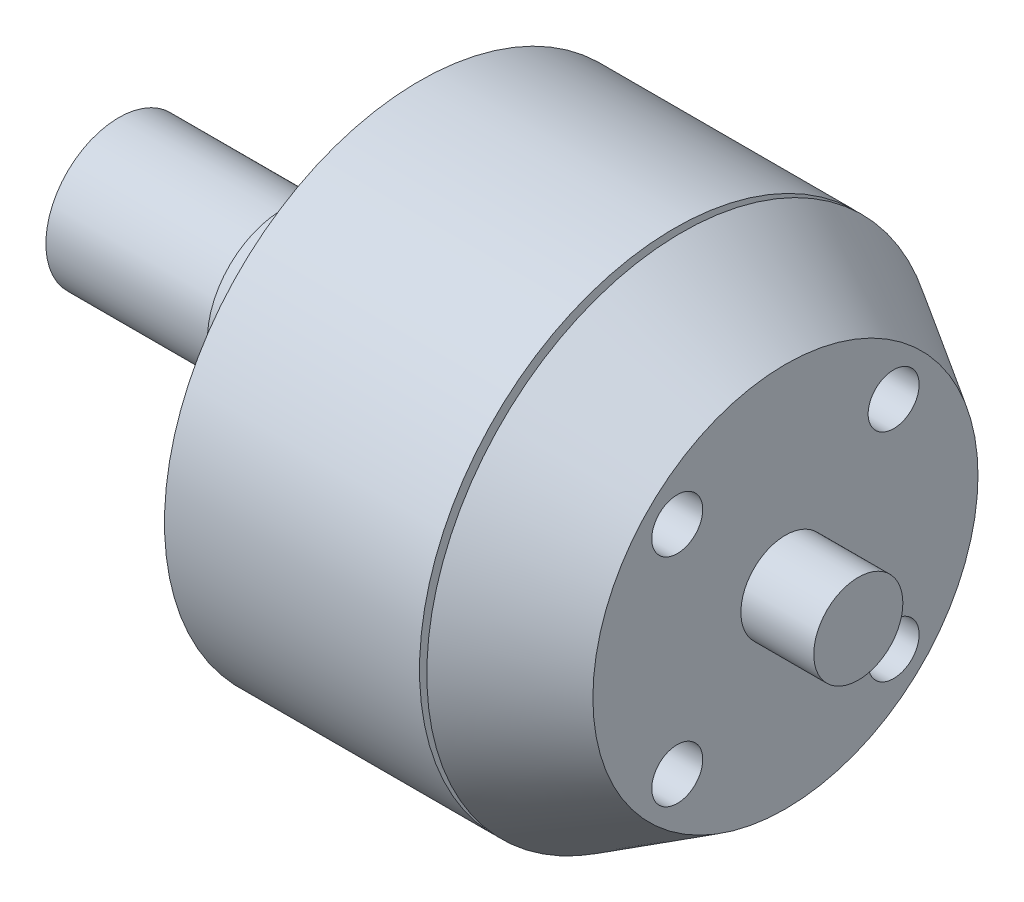
ISO-10303-21;
HEADER;
FILE_DESCRIPTION(('STEP AP214'),'2;1');
FILE_NAME('part.step','',(''),(''),'','','');
FILE_SCHEMA(('AUTOMOTIVE_DESIGN { 1 0 10303 214 1 1 1 1 }'));
ENDSEC;
DATA;
#1=APPLICATION_CONTEXT('core data for automotive mechanical design processes');
#2=APPLICATION_PROTOCOL_DEFINITION('international standard','automotive_design',2000,#1);
#3=PRODUCT_CONTEXT('',#1,'mechanical');
#4=PRODUCT('Part','Part','',(#3));
#5=PRODUCT_RELATED_PRODUCT_CATEGORY('part','',(#4));
#6=PRODUCT_DEFINITION_FORMATION('','',#4);
#7=PRODUCT_DEFINITION_CONTEXT('part definition',#1,'design');
#8=PRODUCT_DEFINITION('design','',#6,#7);
#9=PRODUCT_DEFINITION_SHAPE('','',#8);
#10=(LENGTH_UNIT() NAMED_UNIT(*) SI_UNIT(.MILLI.,.METRE.));
#11=(NAMED_UNIT(*) PLANE_ANGLE_UNIT() SI_UNIT($,.RADIAN.));
#12=(NAMED_UNIT(*) SI_UNIT($,.STERADIAN.) SOLID_ANGLE_UNIT());
#13=UNCERTAINTY_MEASURE_WITH_UNIT(LENGTH_MEASURE(1.E-05),#10,'distance_accuracy_value','');
#14=(GEOMETRIC_REPRESENTATION_CONTEXT(3) GLOBAL_UNCERTAINTY_ASSIGNED_CONTEXT((#13)) GLOBAL_UNIT_ASSIGNED_CONTEXT((#10,
#11,#12)) REPRESENTATION_CONTEXT('',''));
#15=CARTESIAN_POINT('',(0.,0.,0.));
#16=DIRECTION('',(0.,0.,1.));
#17=DIRECTION('',(1.,0.,0.));
#18=AXIS2_PLACEMENT_3D('',#15,#16,#17);
#19=CARTESIAN_POINT('',(11.9545472380385,0.,0.));
#20=DIRECTION('',(1.,0.,0.));
#21=DIRECTION('',(0.,0.,-1.));
#22=AXIS2_PLACEMENT_3D('',#19,#20,#21);
#23=CYLINDRICAL_SURFACE('',#22,2.);
#24=CARTESIAN_POINT('',(-8.34545276196154,0.,0.));
#25=DIRECTION('',(1.,0.,0.));
#26=DIRECTION('',(0.,0.,-1.));
#27=AXIS2_PLACEMENT_3D('',#24,#25,#26);
#28=CIRCLE('',#27,2.);
#29=CARTESIAN_POINT('',(-8.34545276196154,0.,-2.));
#30=VERTEX_POINT('',#29);
#31=EDGE_CURVE('E12',#30,#30,#28,.T.);
#32=ORIENTED_EDGE('',*,*,#31,.T.);
#33=EDGE_LOOP('',(#32));
#34=FACE_BOUND('',#33,.T.);
#35=CARTESIAN_POINT('',(-3.84545276196154,0.,0.));
#36=DIRECTION('',(1.,0.,0.));
#37=DIRECTION('',(0.,0.,-1.));
#38=AXIS2_PLACEMENT_3D('',#35,#36,#37);
#39=CIRCLE('',#38,2.);
#40=CARTESIAN_POINT('',(-3.84545276196154,0.,-2.));
#41=VERTEX_POINT('',#40);
#42=EDGE_CURVE('E93',#41,#41,#39,.T.);
#43=ORIENTED_EDGE('',*,*,#42,.F.);
#44=EDGE_LOOP('',(#43));
#45=FACE_BOUND('',#44,.T.);
#46=ADVANCED_FACE('F47',(#34,#45),#23,.T.);
#47=CARTESIAN_POINT('',(-8.34545276196154,0.,0.));
#48=DIRECTION('',(-1.,0.,0.));
#49=DIRECTION('',(0.,0.,1.));
#50=AXIS2_PLACEMENT_3D('',#47,#48,#49);
#51=PLANE('',#50);
#52=ORIENTED_EDGE('',*,*,#31,.F.);
#53=EDGE_LOOP('',(#52));
#54=FACE_BOUND('',#53,.T.);
#55=ADVANCED_FACE('F150',(#54),#51,.T.);
#56=CARTESIAN_POINT('',(11.9545472380385,0.,-1.22314152816294));
#57=DIRECTION('',(1.,0.,0.));
#58=DIRECTION('',(0.,0.,-1.));
#59=AXIS2_PLACEMENT_3D('',#56,#57,#58);
#60=PLANE('',#59);
#61=CARTESIAN_POINT('',(11.9545472380385,0.,0.));
#62=DIRECTION('',(1.,0.,0.));
#63=DIRECTION('',(0.,0.,-1.));
#64=AXIS2_PLACEMENT_3D('',#61,#62,#63);
#65=CIRCLE('',#64,1.22314152816294);
#66=CARTESIAN_POINT('',(11.9545472380385,0.,-1.22314152816294));
#67=VERTEX_POINT('',#66);
#68=EDGE_CURVE('E53',#67,#67,#65,.T.);
#69=ORIENTED_EDGE('',*,*,#68,.T.);
#70=EDGE_LOOP('',(#69));
#71=FACE_BOUND('',#70,.T.);
#72=ADVANCED_FACE('F145',(#71),#60,.T.);
#73=CARTESIAN_POINT('',(11.9545472380385,0.,0.));
#74=DIRECTION('',(1.,0.,0.));
#75=DIRECTION('',(0.,0.,-1.));
#76=AXIS2_PLACEMENT_3D('',#73,#74,#75);
#77=CYLINDRICAL_SURFACE('',#76,1.22314152816294);
#78=CARTESIAN_POINT('',(9.95454723803846,0.,0.));
#79=DIRECTION('',(1.,0.,0.));
#80=DIRECTION('',(0.,0.,-1.));
#81=AXIS2_PLACEMENT_3D('',#78,#79,#80);
#82=CIRCLE('',#81,1.22314152816294);
#83=CARTESIAN_POINT('',(9.95454723803846,0.,-1.22314152816294));
#84=VERTEX_POINT('',#83);
#85=EDGE_CURVE('E57',#84,#84,#82,.T.);
#86=ORIENTED_EDGE('',*,*,#85,.T.);
#87=EDGE_LOOP('',(#86));
#88=FACE_BOUND('',#87,.T.);
#89=ORIENTED_EDGE('',*,*,#68,.F.);
#90=EDGE_LOOP('',(#89));
#91=FACE_BOUND('',#90,.T.);
#92=ADVANCED_FACE('F134',(#88,#91),#77,.T.);
#93=CARTESIAN_POINT('',(9.95454723803846,0.,-5.28537533518294));
#94=DIRECTION('',(1.,0.,0.));
#95=DIRECTION('',(0.,0.,-1.));
#96=AXIS2_PLACEMENT_3D('',#93,#94,#95);
#97=PLANE('',#96);
#98=CARTESIAN_POINT('',(9.95454723803846,2.9698484809835,-2.9698484809835));
#99=DIRECTION('',(1.,0.,0.));
#100=DIRECTION('',(0.,0.,-1.));
#101=AXIS2_PLACEMENT_3D('',#98,#99,#100);
#102=CIRCLE('',#101,0.7);
#103=CARTESIAN_POINT('',(9.95454723803846,2.9698484809835,-3.6698484809835));
#104=VERTEX_POINT('',#103);
#105=EDGE_CURVE('E110',#104,#104,#102,.T.);
#106=ORIENTED_EDGE('',*,*,#105,.F.);
#107=EDGE_LOOP('',(#106));
#108=FACE_BOUND('',#107,.T.);
#109=CARTESIAN_POINT('',(9.95454723803846,-2.9698484809835,2.9698484809835));
#110=DIRECTION('',(1.,0.,0.));
#111=DIRECTION('',(0.,0.,-1.));
#112=AXIS2_PLACEMENT_3D('',#109,#110,#111);
#113=CIRCLE('',#112,0.7);
#114=CARTESIAN_POINT('',(9.95454723803846,-2.9698484809835,2.2698484809835));
#115=VERTEX_POINT('',#114);
#116=EDGE_CURVE('E103',#115,#115,#113,.T.);
#117=ORIENTED_EDGE('',*,*,#116,.F.);
#118=EDGE_LOOP('',(#117));
#119=FACE_BOUND('',#118,.T.);
#120=CARTESIAN_POINT('',(9.95454723803846,2.9698484809835,2.9698484809835));
#121=DIRECTION('',(1.,0.,0.));
#122=DIRECTION('',(0.,0.,-1.));
#123=AXIS2_PLACEMENT_3D('',#120,#121,#122);
#124=CIRCLE('',#123,0.7);
#125=CARTESIAN_POINT('',(9.95454723803846,2.9698484809835,2.2698484809835));
#126=VERTEX_POINT('',#125);
#127=EDGE_CURVE('E115',#126,#126,#124,.T.);
#128=ORIENTED_EDGE('',*,*,#127,.F.);
#129=EDGE_LOOP('',(#128));
#130=FACE_BOUND('',#129,.T.);
#131=CARTESIAN_POINT('',(9.95454723803846,-2.9698484809835,-2.9698484809835));
#132=DIRECTION('',(1.,0.,0.));
#133=DIRECTION('',(0.,0.,-1.));
#134=AXIS2_PLACEMENT_3D('',#131,#132,#133);
#135=CIRCLE('',#134,0.7);
#136=CARTESIAN_POINT('',(9.95454723803846,-2.9698484809835,-3.6698484809835));
#137=VERTEX_POINT('',#136);
#138=EDGE_CURVE('E97',#137,#137,#135,.T.);
#139=ORIENTED_EDGE('',*,*,#138,.F.);
#140=EDGE_LOOP('',(#139));
#141=FACE_BOUND('',#140,.T.);
#142=CARTESIAN_POINT('',(9.95454723803846,0.,0.));
#143=DIRECTION('',(1.,0.,0.));
#144=DIRECTION('',(0.,0.,-1.));
#145=AXIS2_PLACEMENT_3D('',#142,#143,#144);
#146=CIRCLE('',#145,5.28537533518294);
#147=CARTESIAN_POINT('',(9.95454723803846,0.,-5.28537533518294));
#148=VERTEX_POINT('',#147);
#149=EDGE_CURVE('E61',#148,#148,#146,.T.);
#150=ORIENTED_EDGE('',*,*,#149,.T.);
#151=EDGE_LOOP('',(#150));
#152=FACE_BOUND('',#151,.T.);
#153=ORIENTED_EDGE('',*,*,#85,.F.);
#154=EDGE_LOOP('',(#153));
#155=FACE_BOUND('',#154,.T.);
#156=ADVANCED_FACE('F130',(#108,#119,#130,#141,#152,#155),#97,.T.);
#157=CARTESIAN_POINT('',(9.95454723803846,0.,0.));
#158=DIRECTION('',(-1.,0.,0.));
#159=DIRECTION('',(0.,0.,1.));
#160=AXIS2_PLACEMENT_3D('',#157,#158,#159);
#161=CONICAL_SURFACE('',#160,5.28537533518294,0.542531747359803);
#162=CARTESIAN_POINT('',(7.11047350534955,0.,0.));
#163=DIRECTION('',(1.,0.,0.));
#164=DIRECTION('',(0.,0.,-1.));
#165=AXIS2_PLACEMENT_3D('',#162,#163,#164);
#166=CIRCLE('',#165,7.);
#167=CARTESIAN_POINT('',(7.11047350534955,0.,-7.));
#168=VERTEX_POINT('',#167);
#169=EDGE_CURVE('E66',#168,#168,#166,.T.);
#170=ORIENTED_EDGE('',*,*,#169,.T.);
#171=EDGE_LOOP('',(#170));
#172=FACE_BOUND('',#171,.T.);
#173=ORIENTED_EDGE('',*,*,#149,.F.);
#174=EDGE_LOOP('',(#173));
#175=FACE_BOUND('',#174,.T.);
#176=ADVANCED_FACE('F133',(#172,#175),#161,.T.);
#177=CARTESIAN_POINT('',(7.11047350534955,0.,-5.28537533518294));
#178=DIRECTION('',(-1.,0.,0.));
#179=DIRECTION('',(0.,0.,1.));
#180=AXIS2_PLACEMENT_3D('',#177,#178,#179);
#181=PLANE('',#180);
#182=CARTESIAN_POINT('',(7.11047350534955,0.,0.));
#183=DIRECTION('',(1.,0.,0.));
#184=DIRECTION('',(0.,0.,-1.));
#185=AXIS2_PLACEMENT_3D('',#182,#183,#184);
#186=CIRCLE('',#185,5.28537533518294);
#187=CARTESIAN_POINT('',(7.11047350534955,0.,-5.28537533518294));
#188=VERTEX_POINT('',#187);
#189=EDGE_CURVE('E69',#188,#188,#186,.T.);
#190=ORIENTED_EDGE('',*,*,#189,.T.);
#191=EDGE_LOOP('',(#190));
#192=FACE_BOUND('',#191,.T.);
#193=ORIENTED_EDGE('',*,*,#169,.F.);
#194=EDGE_LOOP('',(#193));
#195=FACE_BOUND('',#194,.T.);
#196=ADVANCED_FACE('F206',(#192,#195),#181,.T.);
#197=CARTESIAN_POINT('',(11.9545472380385,0.,0.));
#198=DIRECTION('',(1.,0.,0.));
#199=DIRECTION('',(0.,0.,-1.));
#200=AXIS2_PLACEMENT_3D('',#197,#198,#199);
#201=CYLINDRICAL_SURFACE('',#200,5.28537533518294);
#202=CARTESIAN_POINT('',(6.91047350534955,0.,0.));
#203=DIRECTION('',(1.,0.,0.));
#204=DIRECTION('',(0.,0.,-1.));
#205=AXIS2_PLACEMENT_3D('',#202,#203,#204);
#206=CIRCLE('',#205,5.28537533518294);
#207=CARTESIAN_POINT('',(6.91047350534955,0.,-5.28537533518294));
#208=VERTEX_POINT('',#207);
#209=EDGE_CURVE('E72',#208,#208,#206,.T.);
#210=ORIENTED_EDGE('',*,*,#209,.T.);
#211=EDGE_LOOP('',(#210));
#212=FACE_BOUND('',#211,.T.);
#213=ORIENTED_EDGE('',*,*,#189,.F.);
#214=EDGE_LOOP('',(#213));
#215=FACE_BOUND('',#214,.T.);
#216=ADVANCED_FACE('F200',(#212,#215),#201,.T.);
#217=CARTESIAN_POINT('',(6.91047350534955,0.,-7.));
#218=DIRECTION('',(1.,0.,0.));
#219=DIRECTION('',(0.,0.,-1.));
#220=AXIS2_PLACEMENT_3D('',#217,#218,#219);
#221=PLANE('',#220);
#222=CARTESIAN_POINT('',(6.91047350534955,0.,0.));
#223=DIRECTION('',(1.,0.,0.));
#224=DIRECTION('',(0.,0.,-1.));
#225=AXIS2_PLACEMENT_3D('',#222,#223,#224);
#226=CIRCLE('',#225,7.);
#227=CARTESIAN_POINT('',(6.91047350534955,0.,-7.));
#228=VERTEX_POINT('',#227);
#229=EDGE_CURVE('E75',#228,#228,#226,.T.);
#230=ORIENTED_EDGE('',*,*,#229,.T.);
#231=EDGE_LOOP('',(#230));
#232=FACE_BOUND('',#231,.T.);
#233=ORIENTED_EDGE('',*,*,#209,.F.);
#234=EDGE_LOOP('',(#233));
#235=FACE_BOUND('',#234,.T.);
#236=ADVANCED_FACE('F194',(#232,#235),#221,.T.);
#237=CARTESIAN_POINT('',(11.9545472380385,0.,0.));
#238=DIRECTION('',(1.,0.,0.));
#239=DIRECTION('',(0.,0.,-1.));
#240=AXIS2_PLACEMENT_3D('',#237,#238,#239);
#241=CYLINDRICAL_SURFACE('',#240,7.);
#242=CARTESIAN_POINT('',(-0.0895264946504538,0.,0.));
#243=DIRECTION('',(1.,0.,0.));
#244=DIRECTION('',(0.,0.,-1.));
#245=AXIS2_PLACEMENT_3D('',#242,#243,#244);
#246=CIRCLE('',#245,7.);
#247=CARTESIAN_POINT('',(-0.0895264946504538,0.,-7.));
#248=VERTEX_POINT('',#247);
#249=EDGE_CURVE('E78',#248,#248,#246,.T.);
#250=ORIENTED_EDGE('',*,*,#249,.T.);
#251=EDGE_LOOP('',(#250));
#252=FACE_BOUND('',#251,.T.);
#253=ORIENTED_EDGE('',*,*,#229,.F.);
#254=EDGE_LOOP('',(#253));
#255=FACE_BOUND('',#254,.T.);
#256=ADVANCED_FACE('F188',(#252,#255),#241,.T.);
#257=CARTESIAN_POINT('',(-0.0895264946504538,0.,0.));
#258=DIRECTION('',(1.,0.,0.));
#259=DIRECTION('',(0.,0.,-1.));
#260=AXIS2_PLACEMENT_3D('',#257,#258,#259);
#261=CONICAL_SURFACE('',#260,7.,1.1571430174049);
#262=CARTESIAN_POINT('',(-1.84545276196154,0.,0.));
#263=DIRECTION('',(1.,0.,0.));
#264=DIRECTION('',(0.,0.,-1.));
#265=AXIS2_PLACEMENT_3D('',#262,#263,#264);
#266=CIRCLE('',#265,3.);
#267=CARTESIAN_POINT('',(-1.84545276196154,0.,-3.));
#268=VERTEX_POINT('',#267);
#269=EDGE_CURVE('E81',#268,#268,#266,.T.);
#270=ORIENTED_EDGE('',*,*,#269,.T.);
#271=EDGE_LOOP('',(#270));
#272=FACE_BOUND('',#271,.T.);
#273=ORIENTED_EDGE('',*,*,#249,.F.);
#274=EDGE_LOOP('',(#273));
#275=FACE_BOUND('',#274,.T.);
#276=ADVANCED_FACE('F182',(#272,#275),#261,.T.);
#277=CARTESIAN_POINT('',(11.9545472380385,0.,0.));
#278=DIRECTION('',(1.,0.,0.));
#279=DIRECTION('',(0.,0.,-1.));
#280=AXIS2_PLACEMENT_3D('',#277,#278,#279);
#281=CYLINDRICAL_SURFACE('',#280,3.);
#282=CARTESIAN_POINT('',(-2.34545276196154,0.,0.));
#283=DIRECTION('',(1.,0.,0.));
#284=DIRECTION('',(0.,0.,-1.));
#285=AXIS2_PLACEMENT_3D('',#282,#283,#284);
#286=CIRCLE('',#285,3.);
#287=CARTESIAN_POINT('',(-2.34545276196154,0.,-3.));
#288=VERTEX_POINT('',#287);
#289=EDGE_CURVE('E84',#288,#288,#286,.T.);
#290=ORIENTED_EDGE('',*,*,#289,.T.);
#291=EDGE_LOOP('',(#290));
#292=FACE_BOUND('',#291,.T.);
#293=ORIENTED_EDGE('',*,*,#269,.F.);
#294=EDGE_LOOP('',(#293));
#295=FACE_BOUND('',#294,.T.);
#296=ADVANCED_FACE('F176',(#292,#295),#281,.T.);
#297=CARTESIAN_POINT('',(-2.34545276196154,0.,-2.06774211191529));
#298=DIRECTION('',(-1.,0.,0.));
#299=DIRECTION('',(0.,0.,1.));
#300=AXIS2_PLACEMENT_3D('',#297,#298,#299);
#301=PLANE('',#300);
#302=CARTESIAN_POINT('',(-2.34545276196154,0.,0.));
#303=DIRECTION('',(1.,0.,0.));
#304=DIRECTION('',(0.,0.,-1.));
#305=AXIS2_PLACEMENT_3D('',#302,#303,#304);
#306=CIRCLE('',#305,2.06774211191529);
#307=CARTESIAN_POINT('',(-2.34545276196154,0.,-2.06774211191529));
#308=VERTEX_POINT('',#307);
#309=EDGE_CURVE('E87',#308,#308,#306,.T.);
#310=ORIENTED_EDGE('',*,*,#309,.T.);
#311=EDGE_LOOP('',(#310));
#312=FACE_BOUND('',#311,.T.);
#313=ORIENTED_EDGE('',*,*,#289,.F.);
#314=EDGE_LOOP('',(#313));
#315=FACE_BOUND('',#314,.T.);
#316=ADVANCED_FACE('F170',(#312,#315),#301,.T.);
#317=CARTESIAN_POINT('',(11.9545472380385,0.,0.));
#318=DIRECTION('',(1.,0.,0.));
#319=DIRECTION('',(0.,0.,-1.));
#320=AXIS2_PLACEMENT_3D('',#317,#318,#319);
#321=CYLINDRICAL_SURFACE('',#320,2.06774211191529);
#322=CARTESIAN_POINT('',(-3.84545276196154,0.,0.));
#323=DIRECTION('',(1.,0.,0.));
#324=DIRECTION('',(0.,0.,-1.));
#325=AXIS2_PLACEMENT_3D('',#322,#323,#324);
#326=CIRCLE('',#325,2.06774211191529);
#327=CARTESIAN_POINT('',(-3.84545276196154,0.,-2.06774211191529));
#328=VERTEX_POINT('',#327);
#329=EDGE_CURVE('E90',#328,#328,#326,.T.);
#330=ORIENTED_EDGE('',*,*,#329,.T.);
#331=EDGE_LOOP('',(#330));
#332=FACE_BOUND('',#331,.T.);
#333=ORIENTED_EDGE('',*,*,#309,.F.);
#334=EDGE_LOOP('',(#333));
#335=FACE_BOUND('',#334,.T.);
#336=ADVANCED_FACE('F164',(#332,#335),#321,.T.);
#337=CARTESIAN_POINT('',(-3.84545276196154,0.,-2.));
#338=DIRECTION('',(-1.,0.,0.));
#339=DIRECTION('',(0.,0.,1.));
#340=AXIS2_PLACEMENT_3D('',#337,#338,#339);
#341=PLANE('',#340);
#342=ORIENTED_EDGE('',*,*,#42,.T.);
#343=EDGE_LOOP('',(#342));
#344=FACE_BOUND('',#343,.T.);
#345=ORIENTED_EDGE('',*,*,#329,.F.);
#346=EDGE_LOOP('',(#345));
#347=FACE_BOUND('',#346,.T.);
#348=ADVANCED_FACE('F160',(#344,#347),#341,.T.);
#349=CARTESIAN_POINT('',(7.95454723803846,-2.9698484809835,-2.9698484809835));
#350=DIRECTION('',(1.,0.,0.));
#351=DIRECTION('',(0.,0.,-1.));
#352=AXIS2_PLACEMENT_3D('',#349,#350,#351);
#353=CYLINDRICAL_SURFACE('',#352,0.7);
#354=CARTESIAN_POINT('',(7.95454723803846,-2.9698484809835,-2.9698484809835));
#355=DIRECTION('',(1.,0.,0.));
#356=DIRECTION('',(0.,0.,-1.));
#357=AXIS2_PLACEMENT_3D('',#354,#355,#356);
#358=CIRCLE('',#357,0.7);
#359=CARTESIAN_POINT('',(7.95454723803846,-2.9698484809835,-3.6698484809835));
#360=VERTEX_POINT('',#359);
#361=EDGE_CURVE('E96',#360,#360,#358,.T.);
#362=ORIENTED_EDGE('',*,*,#361,.F.);
#363=EDGE_LOOP('',(#362));
#364=FACE_BOUND('',#363,.T.);
#365=ORIENTED_EDGE('',*,*,#138,.T.);
#366=EDGE_LOOP('',(#365));
#367=FACE_BOUND('',#366,.T.);
#368=ADVANCED_FACE('F163',(#364,#367),#353,.F.);
#369=CARTESIAN_POINT('',(7.95454723803846,-2.9698484809835,-2.9698484809835));
#370=DIRECTION('',(1.,0.,0.));
#371=DIRECTION('',(0.,0.,-1.));
#372=AXIS2_PLACEMENT_3D('',#369,#370,#371);
#373=PLANE('',#372);
#374=ORIENTED_EDGE('',*,*,#361,.T.);
#375=EDGE_LOOP('',(#374));
#376=FACE_BOUND('',#375,.T.);
#377=ADVANCED_FACE('F126',(#376),#373,.T.);
#378=CARTESIAN_POINT('',(7.95454723803846,2.9698484809835,2.9698484809835));
#379=DIRECTION('',(1.,0.,0.));
#380=DIRECTION('',(0.,0.,-1.));
#381=AXIS2_PLACEMENT_3D('',#378,#379,#380);
#382=CYLINDRICAL_SURFACE('',#381,0.7);
#383=CARTESIAN_POINT('',(7.95454723803846,2.9698484809835,2.9698484809835));
#384=DIRECTION('',(1.,0.,0.));
#385=DIRECTION('',(0.,0.,-1.));
#386=AXIS2_PLACEMENT_3D('',#383,#384,#385);
#387=CIRCLE('',#386,0.7);
#388=CARTESIAN_POINT('',(7.95454723803846,2.9698484809835,2.2698484809835));
#389=VERTEX_POINT('',#388);
#390=EDGE_CURVE('E107',#389,#389,#387,.T.);
#391=ORIENTED_EDGE('',*,*,#390,.F.);
#392=EDGE_LOOP('',(#391));
#393=FACE_BOUND('',#392,.T.);
#394=ORIENTED_EDGE('',*,*,#127,.T.);
#395=EDGE_LOOP('',(#394));
#396=FACE_BOUND('',#395,.T.);
#397=ADVANCED_FACE('F123',(#393,#396),#382,.F.);
#398=CARTESIAN_POINT('',(7.95454723803846,2.9698484809835,2.9698484809835));
#399=DIRECTION('',(1.,0.,0.));
#400=DIRECTION('',(0.,0.,-1.));
#401=AXIS2_PLACEMENT_3D('',#398,#399,#400);
#402=PLANE('',#401);
#403=ORIENTED_EDGE('',*,*,#390,.T.);
#404=EDGE_LOOP('',(#403));
#405=FACE_BOUND('',#404,.T.);
#406=ADVANCED_FACE('F121',(#405),#402,.T.);
#407=CARTESIAN_POINT('',(7.95454723803846,-2.9698484809835,2.9698484809835));
#408=DIRECTION('',(1.,0.,0.));
#409=DIRECTION('',(0.,0.,-1.));
#410=AXIS2_PLACEMENT_3D('',#407,#408,#409);
#411=CYLINDRICAL_SURFACE('',#410,0.7);
#412=CARTESIAN_POINT('',(7.95454723803846,-2.9698484809835,2.9698484809835));
#413=DIRECTION('',(1.,0.,0.));
#414=DIRECTION('',(0.,0.,-1.));
#415=AXIS2_PLACEMENT_3D('',#412,#413,#414);
#416=CIRCLE('',#415,0.7);
#417=CARTESIAN_POINT('',(7.95454723803846,-2.9698484809835,2.2698484809835));
#418=VERTEX_POINT('',#417);
#419=EDGE_CURVE('E106',#418,#418,#416,.T.);
#420=ORIENTED_EDGE('',*,*,#419,.F.);
#421=EDGE_LOOP('',(#420));
#422=FACE_BOUND('',#421,.T.);
#423=ORIENTED_EDGE('',*,*,#116,.T.);
#424=EDGE_LOOP('',(#423));
#425=FACE_BOUND('',#424,.T.);
#426=ADVANCED_FACE('F227',(#422,#425),#411,.F.);
#427=CARTESIAN_POINT('',(7.95454723803846,-2.9698484809835,2.9698484809835));
#428=DIRECTION('',(1.,0.,0.));
#429=DIRECTION('',(0.,0.,-1.));
#430=AXIS2_PLACEMENT_3D('',#427,#428,#429);
#431=PLANE('',#430);
#432=ORIENTED_EDGE('',*,*,#419,.T.);
#433=EDGE_LOOP('',(#432));
#434=FACE_BOUND('',#433,.T.);
#435=ADVANCED_FACE('F230',(#434),#431,.T.);
#436=CARTESIAN_POINT('',(7.95454723803846,2.9698484809835,-2.9698484809835));
#437=DIRECTION('',(1.,0.,0.));
#438=DIRECTION('',(0.,0.,-1.));
#439=AXIS2_PLACEMENT_3D('',#436,#437,#438);
#440=CYLINDRICAL_SURFACE('',#439,0.7);
#441=CARTESIAN_POINT('',(7.95454723803846,2.9698484809835,-2.9698484809835));
#442=DIRECTION('',(1.,0.,0.));
#443=DIRECTION('',(0.,0.,-1.));
#444=AXIS2_PLACEMENT_3D('',#441,#442,#443);
#445=CIRCLE('',#444,0.7);
#446=CARTESIAN_POINT('',(7.95454723803846,2.9698484809835,-3.6698484809835));
#447=VERTEX_POINT('',#446);
#448=EDGE_CURVE('E100',#447,#447,#445,.T.);
#449=ORIENTED_EDGE('',*,*,#448,.F.);
#450=EDGE_LOOP('',(#449));
#451=FACE_BOUND('',#450,.T.);
#452=ORIENTED_EDGE('',*,*,#105,.T.);
#453=EDGE_LOOP('',(#452));
#454=FACE_BOUND('',#453,.T.);
#455=ADVANCED_FACE('F234',(#451,#454),#440,.F.);
#456=CARTESIAN_POINT('',(7.95454723803846,2.9698484809835,-2.9698484809835));
#457=DIRECTION('',(1.,0.,0.));
#458=DIRECTION('',(0.,0.,-1.));
#459=AXIS2_PLACEMENT_3D('',#456,#457,#458);
#460=PLANE('',#459);
#461=ORIENTED_EDGE('',*,*,#448,.T.);
#462=EDGE_LOOP('',(#461));
#463=FACE_BOUND('',#462,.T.);
#464=ADVANCED_FACE('F238',(#463),#460,.T.);
#465=CLOSED_SHELL('',(#46,#55,#72,#92,#156,#176,#196,#216,#236,#256,#276,#296,#316,#336,#348,
#368,#377,#397,#406,#426,#435,#455,#464));
#466=MANIFOLD_SOLID_BREP('B2',#465);
#467=ADVANCED_BREP_SHAPE_REPRESENTATION('',(#18,#466),#14);
#468=SHAPE_DEFINITION_REPRESENTATION(#9,#467);
ENDSEC;
END-ISO-10303-21;
